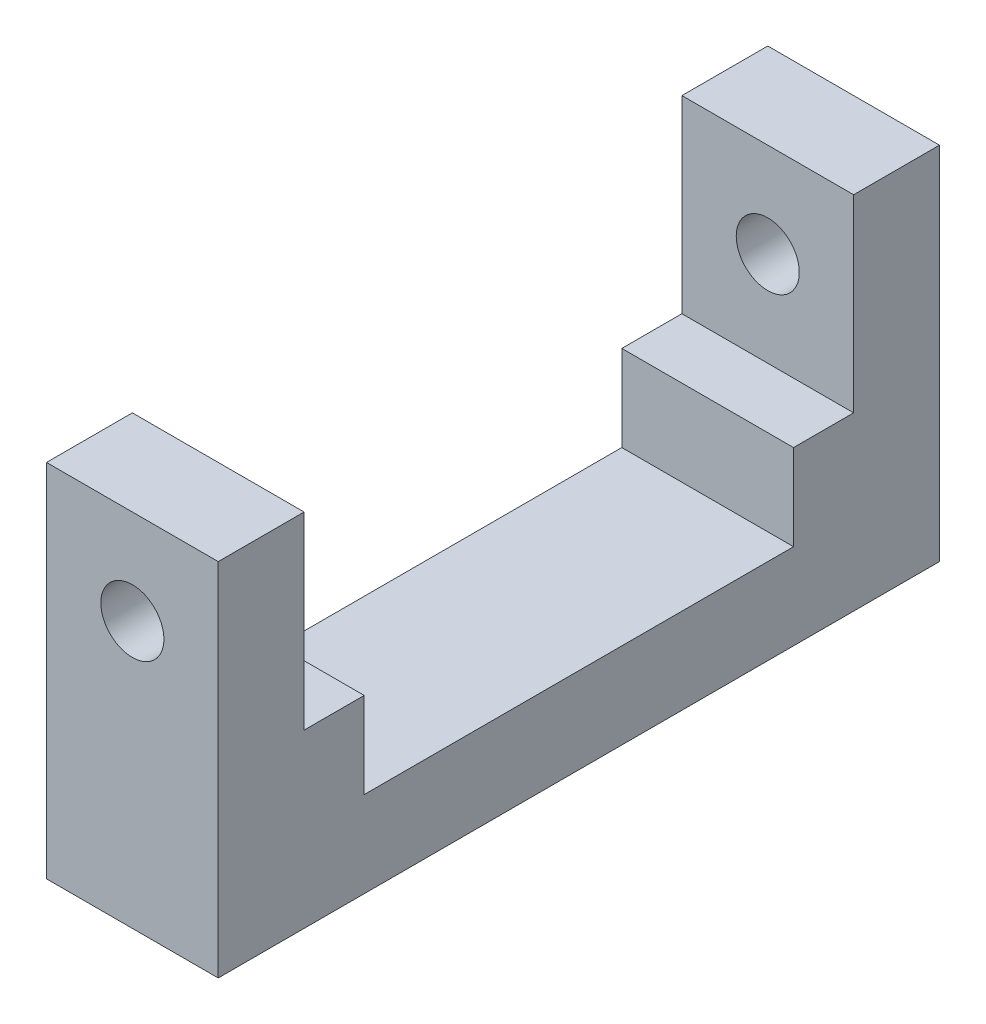
ISO-10303-21;
HEADER;
FILE_DESCRIPTION(('STEP AP214'),'2;1');
FILE_NAME('part.step','',(''),(''),'','','');
FILE_SCHEMA(('AUTOMOTIVE_DESIGN { 1 0 10303 214 1 1 1 1 }'));
ENDSEC;
DATA;
#1=APPLICATION_CONTEXT('core data for automotive mechanical design processes');
#2=APPLICATION_PROTOCOL_DEFINITION('international standard','automotive_design',2000,#1);
#3=PRODUCT_CONTEXT('',#1,'mechanical');
#4=PRODUCT('Part','Part','',(#3));
#5=PRODUCT_RELATED_PRODUCT_CATEGORY('part','',(#4));
#6=PRODUCT_DEFINITION_FORMATION('','',#4);
#7=PRODUCT_DEFINITION_CONTEXT('part definition',#1,'design');
#8=PRODUCT_DEFINITION('design','',#6,#7);
#9=PRODUCT_DEFINITION_SHAPE('','',#8);
#10=(LENGTH_UNIT() NAMED_UNIT(*) SI_UNIT(.MILLI.,.METRE.));
#11=(NAMED_UNIT(*) PLANE_ANGLE_UNIT() SI_UNIT($,.RADIAN.));
#12=(NAMED_UNIT(*) SI_UNIT($,.STERADIAN.) SOLID_ANGLE_UNIT());
#13=UNCERTAINTY_MEASURE_WITH_UNIT(LENGTH_MEASURE(1.E-05),#10,'distance_accuracy_value','');
#14=(GEOMETRIC_REPRESENTATION_CONTEXT(3) GLOBAL_UNCERTAINTY_ASSIGNED_CONTEXT((#13)) GLOBAL_UNIT_ASSIGNED_CONTEXT((#10,
#11,#12)) REPRESENTATION_CONTEXT('',''));
#15=CARTESIAN_POINT('',(0.,0.,0.));
#16=DIRECTION('',(0.,0.,1.));
#17=DIRECTION('',(1.,0.,0.));
#18=AXIS2_PLACEMENT_3D('',#15,#16,#17);
#19=CARTESIAN_POINT('',(10.,0.,-16.));
#20=DIRECTION('',(0.,0.,-1.));
#21=DIRECTION('',(-1.,0.,0.));
#22=AXIS2_PLACEMENT_3D('',#19,#20,#21);
#23=PLANE('',#22);
#24=CARTESIAN_POINT('',(5.,5.,-16.));
#25=DIRECTION('',(0.,0.,-1.));
#26=DIRECTION('',(-1.,0.,0.));
#27=AXIS2_PLACEMENT_3D('',#24,#25,#26);
#28=CIRCLE('',#27,1.83658591452709);
#29=CARTESIAN_POINT('',(3.16341408547291,5.,-16.));
#30=VERTEX_POINT('',#29);
#31=EDGE_CURVE('E168',#30,#30,#28,.F.);
#32=ORIENTED_EDGE('',*,*,#31,.F.);
#33=EDGE_LOOP('',(#32));
#34=FACE_BOUND('',#33,.T.);
#35=DIRECTION('',(-1.,0.,0.));
#36=VECTOR('',#35,1.);
#37=CARTESIAN_POINT('',(10.,-0.500000000000001,-16.));
#38=LINE('',#37,#36);
#39=CARTESIAN_POINT('',(10.,-0.500000000000001,-16.));
#40=VERTEX_POINT('',#39);
#41=CARTESIAN_POINT('',(0.,-0.500000000000001,-16.));
#42=VERTEX_POINT('',#41);
#43=EDGE_CURVE('E12',#40,#42,#38,.T.);
#44=ORIENTED_EDGE('',*,*,#43,.F.);
#45=DIRECTION('',(0.,-1.,0.));
#46=VECTOR('',#45,1.);
#47=CARTESIAN_POINT('',(10.,0.,-16.));
#48=LINE('',#47,#46);
#49=CARTESIAN_POINT('',(10.,10.5,-16.));
#50=VERTEX_POINT('',#49);
#51=EDGE_CURVE('E278',#50,#40,#48,.T.);
#52=ORIENTED_EDGE('',*,*,#51,.F.);
#53=DIRECTION('',(-1.,0.,0.));
#54=VECTOR('',#53,1.);
#55=CARTESIAN_POINT('',(10.,10.5,-16.));
#56=LINE('',#55,#54);
#57=CARTESIAN_POINT('',(0.,10.5,-16.));
#58=VERTEX_POINT('',#57);
#59=EDGE_CURVE('E184',#50,#58,#56,.T.);
#60=ORIENTED_EDGE('',*,*,#59,.T.);
#61=DIRECTION('',(0.,-1.,0.));
#62=VECTOR('',#61,1.);
#63=CARTESIAN_POINT('',(0.,0.,-16.));
#64=LINE('',#63,#62);
#65=EDGE_CURVE('E203',#58,#42,#64,.T.);
#66=ORIENTED_EDGE('',*,*,#65,.T.);
#67=EDGE_LOOP('',(#44,#52,#60,#66));
#68=FACE_BOUND('',#67,.T.);
#69=ADVANCED_FACE('F107',(#34,#68),#23,.F.);
#70=CARTESIAN_POINT('',(10.,-5.5,0.));
#71=DIRECTION('',(0.,1.,0.));
#72=DIRECTION('',(0.,0.,1.));
#73=AXIS2_PLACEMENT_3D('',#70,#71,#72);
#74=PLANE('',#73);
#75=DIRECTION('',(0.,0.,-1.));
#76=VECTOR('',#75,1.);
#77=CARTESIAN_POINT('',(0.,-5.5,0.));
#78=LINE('',#77,#76);
#79=CARTESIAN_POINT('',(0.,-5.5,12.5));
#80=VERTEX_POINT('',#79);
#81=CARTESIAN_POINT('',(0.,-5.5,-12.5));
#82=VERTEX_POINT('',#81);
#83=EDGE_CURVE('E173',#80,#82,#78,.T.);
#84=ORIENTED_EDGE('',*,*,#83,.F.);
#85=DIRECTION('',(1.,0.,0.));
#86=VECTOR('',#85,1.);
#87=CARTESIAN_POINT('',(10.,-5.5,12.5));
#88=LINE('',#87,#86);
#89=CARTESIAN_POINT('',(10.,-5.5,12.5));
#90=VERTEX_POINT('',#89);
#91=EDGE_CURVE('E117',#80,#90,#88,.T.);
#92=ORIENTED_EDGE('',*,*,#91,.T.);
#93=DIRECTION('',(0.,0.,-1.));
#94=VECTOR('',#93,1.);
#95=CARTESIAN_POINT('',(10.,-5.5,0.));
#96=LINE('',#95,#94);
#97=CARTESIAN_POINT('',(10.,-5.5,-12.5));
#98=VERTEX_POINT('',#97);
#99=EDGE_CURVE('E276',#90,#98,#96,.T.);
#100=ORIENTED_EDGE('',*,*,#99,.T.);
#101=DIRECTION('',(-1.,0.,0.));
#102=VECTOR('',#101,1.);
#103=CARTESIAN_POINT('',(10.,-5.5,-12.5));
#104=LINE('',#103,#102);
#105=EDGE_CURVE('E178',#98,#82,#104,.T.);
#106=ORIENTED_EDGE('',*,*,#105,.T.);
#107=EDGE_LOOP('',(#84,#92,#100,#106));
#108=FACE_BOUND('',#107,.T.);
#109=ADVANCED_FACE('F218',(#108),#74,.T.);
#110=CARTESIAN_POINT('',(10.,0.,16.));
#111=DIRECTION('',(0.,0.,-1.));
#112=DIRECTION('',(0.,1.,0.));
#113=AXIS2_PLACEMENT_3D('',#110,#111,#112);
#114=PLANE('',#113);
#115=CARTESIAN_POINT('',(5.,5.,16.));
#116=DIRECTION('',(0.,0.,-1.));
#117=DIRECTION('',(0.,1.,0.));
#118=AXIS2_PLACEMENT_3D('',#115,#116,#117);
#119=CIRCLE('',#118,1.83658591452709);
#120=CARTESIAN_POINT('',(3.16341408547291,5.,16.));
#121=VERTEX_POINT('',#120);
#122=EDGE_CURVE('E284',#121,#121,#119,.F.);
#123=ORIENTED_EDGE('',*,*,#122,.T.);
#124=EDGE_LOOP('',(#123));
#125=FACE_BOUND('',#124,.T.);
#126=DIRECTION('',(0.,-1.,0.));
#127=VECTOR('',#126,1.);
#128=CARTESIAN_POINT('',(10.,0.,16.));
#129=LINE('',#128,#127);
#130=CARTESIAN_POINT('',(10.,10.5,16.));
#131=VERTEX_POINT('',#130);
#132=CARTESIAN_POINT('',(10.,-0.500000000000004,16.));
#133=VERTEX_POINT('',#132);
#134=EDGE_CURVE('E274',#131,#133,#129,.T.);
#135=ORIENTED_EDGE('',*,*,#134,.T.);
#136=DIRECTION('',(-1.,0.,0.));
#137=VECTOR('',#136,1.);
#138=CARTESIAN_POINT('',(10.,-0.500000000000004,16.));
#139=LINE('',#138,#137);
#140=CARTESIAN_POINT('',(0.,-0.500000000000004,16.));
#141=VERTEX_POINT('',#140);
#142=EDGE_CURVE('E126',#133,#141,#139,.T.);
#143=ORIENTED_EDGE('',*,*,#142,.T.);
#144=DIRECTION('',(0.,-1.,0.));
#145=VECTOR('',#144,1.);
#146=CARTESIAN_POINT('',(0.,0.,16.));
#147=LINE('',#146,#145);
#148=CARTESIAN_POINT('',(0.,10.5,16.));
#149=VERTEX_POINT('',#148);
#150=EDGE_CURVE('E219',#149,#141,#147,.T.);
#151=ORIENTED_EDGE('',*,*,#150,.F.);
#152=DIRECTION('',(-1.,0.,0.));
#153=VECTOR('',#152,1.);
#154=CARTESIAN_POINT('',(10.,10.5,16.));
#155=LINE('',#154,#153);
#156=EDGE_CURVE('E191',#131,#149,#155,.T.);
#157=ORIENTED_EDGE('',*,*,#156,.F.);
#158=EDGE_LOOP('',(#135,#143,#151,#157));
#159=FACE_BOUND('',#158,.T.);
#160=ADVANCED_FACE('F262',(#125,#159),#114,.T.);
#161=CARTESIAN_POINT('',(10.,10.5,0.));
#162=DIRECTION('',(0.,1.,0.));
#163=DIRECTION('',(0.,0.,1.));
#164=AXIS2_PLACEMENT_3D('',#161,#162,#163);
#165=PLANE('',#164);
#166=DIRECTION('',(0.,0.,-1.));
#167=VECTOR('',#166,1.);
#168=CARTESIAN_POINT('',(0.,10.5,0.));
#169=LINE('',#168,#167);
#170=CARTESIAN_POINT('',(0.,10.5,21.));
#171=VERTEX_POINT('',#170);
#172=EDGE_CURVE('E205',#171,#149,#169,.T.);
#173=ORIENTED_EDGE('',*,*,#172,.F.);
#174=DIRECTION('',(-1.,0.,0.));
#175=VECTOR('',#174,1.);
#176=CARTESIAN_POINT('',(10.,10.5,21.));
#177=LINE('',#176,#175);
#178=CARTESIAN_POINT('',(10.,10.5,21.));
#179=VERTEX_POINT('',#178);
#180=EDGE_CURVE('E244',#179,#171,#177,.T.);
#181=ORIENTED_EDGE('',*,*,#180,.F.);
#182=DIRECTION('',(0.,0.,-1.));
#183=VECTOR('',#182,1.);
#184=CARTESIAN_POINT('',(10.,10.5,0.));
#185=LINE('',#184,#183);
#186=EDGE_CURVE('E259',#179,#131,#185,.T.);
#187=ORIENTED_EDGE('',*,*,#186,.T.);
#188=ORIENTED_EDGE('',*,*,#156,.T.);
#189=EDGE_LOOP('',(#173,#181,#187,#188));
#190=FACE_BOUND('',#189,.T.);
#191=ADVANCED_FACE('F253',(#190),#165,.T.);
#192=CARTESIAN_POINT('',(10.,0.,21.));
#193=DIRECTION('',(0.,0.,1.));
#194=DIRECTION('',(0.,-1.,0.));
#195=AXIS2_PLACEMENT_3D('',#192,#193,#194);
#196=PLANE('',#195);
#197=CARTESIAN_POINT('',(5.,5.,21.));
#198=DIRECTION('',(0.,0.,1.));
#199=DIRECTION('',(0.,-1.,0.));
#200=AXIS2_PLACEMENT_3D('',#197,#198,#199);
#201=CIRCLE('',#200,1.83658591452709);
#202=CARTESIAN_POINT('',(3.16341408547291,5.,21.));
#203=VERTEX_POINT('',#202);
#204=EDGE_CURVE('E287',#203,#203,#201,.F.);
#205=ORIENTED_EDGE('',*,*,#204,.T.);
#206=EDGE_LOOP('',(#205));
#207=FACE_BOUND('',#206,.T.);
#208=DIRECTION('',(0.,1.,0.));
#209=VECTOR('',#208,1.);
#210=CARTESIAN_POINT('',(0.,0.,21.));
#211=LINE('',#210,#209);
#212=CARTESIAN_POINT('',(0.,-10.5,21.));
#213=VERTEX_POINT('',#212);
#214=EDGE_CURVE('E224',#213,#171,#211,.T.);
#215=ORIENTED_EDGE('',*,*,#214,.F.);
#216=DIRECTION('',(-1.,0.,0.));
#217=VECTOR('',#216,1.);
#218=CARTESIAN_POINT('',(10.,-10.5,21.));
#219=LINE('',#218,#217);
#220=CARTESIAN_POINT('',(10.,-10.5,21.));
#221=VERTEX_POINT('',#220);
#222=EDGE_CURVE('E241',#221,#213,#219,.T.);
#223=ORIENTED_EDGE('',*,*,#222,.F.);
#224=DIRECTION('',(0.,1.,0.));
#225=VECTOR('',#224,1.);
#226=CARTESIAN_POINT('',(10.,0.,21.));
#227=LINE('',#226,#225);
#228=EDGE_CURVE('E271',#221,#179,#227,.T.);
#229=ORIENTED_EDGE('',*,*,#228,.T.);
#230=ORIENTED_EDGE('',*,*,#180,.T.);
#231=EDGE_LOOP('',(#215,#223,#229,#230));
#232=FACE_BOUND('',#231,.T.);
#233=ADVANCED_FACE('F342',(#207,#232),#196,.T.);
#234=CARTESIAN_POINT('',(10.,-10.5,0.));
#235=DIRECTION('',(0.,1.,0.));
#236=DIRECTION('',(0.,0.,1.));
#237=AXIS2_PLACEMENT_3D('',#234,#235,#236);
#238=PLANE('',#237);
#239=DIRECTION('',(0.,0.,-1.));
#240=VECTOR('',#239,1.);
#241=CARTESIAN_POINT('',(0.,-10.5,0.));
#242=LINE('',#241,#240);
#243=CARTESIAN_POINT('',(0.,-10.5,-21.));
#244=VERTEX_POINT('',#243);
#245=EDGE_CURVE('E227',#213,#244,#242,.T.);
#246=ORIENTED_EDGE('',*,*,#245,.T.);
#247=DIRECTION('',(-1.,0.,0.));
#248=VECTOR('',#247,1.);
#249=CARTESIAN_POINT('',(10.,-10.5,-21.));
#250=LINE('',#249,#248);
#251=CARTESIAN_POINT('',(10.,-10.5,-21.));
#252=VERTEX_POINT('',#251);
#253=EDGE_CURVE('E237',#252,#244,#250,.T.);
#254=ORIENTED_EDGE('',*,*,#253,.F.);
#255=DIRECTION('',(0.,0.,-1.));
#256=VECTOR('',#255,1.);
#257=CARTESIAN_POINT('',(10.,-10.5,0.));
#258=LINE('',#257,#256);
#259=EDGE_CURVE('E268',#221,#252,#258,.T.);
#260=ORIENTED_EDGE('',*,*,#259,.F.);
#261=ORIENTED_EDGE('',*,*,#222,.T.);
#262=EDGE_LOOP('',(#246,#254,#260,#261));
#263=FACE_BOUND('',#262,.T.);
#264=ADVANCED_FACE('F301',(#263),#238,.F.);
#265=CARTESIAN_POINT('',(10.,0.,-21.));
#266=DIRECTION('',(0.,0.,1.));
#267=DIRECTION('',(0.,-1.,0.));
#268=AXIS2_PLACEMENT_3D('',#265,#266,#267);
#269=PLANE('',#268);
#270=CARTESIAN_POINT('',(5.,5.,-21.));
#271=DIRECTION('',(0.,0.,1.));
#272=DIRECTION('',(0.,-1.,0.));
#273=AXIS2_PLACEMENT_3D('',#270,#271,#272);
#274=CIRCLE('',#273,1.83658591452709);
#275=CARTESIAN_POINT('',(3.16341408547291,5.,-21.));
#276=VERTEX_POINT('',#275);
#277=EDGE_CURVE('E111',#276,#276,#274,.F.);
#278=ORIENTED_EDGE('',*,*,#277,.F.);
#279=EDGE_LOOP('',(#278));
#280=FACE_BOUND('',#279,.T.);
#281=DIRECTION('',(0.,1.,0.));
#282=VECTOR('',#281,1.);
#283=CARTESIAN_POINT('',(0.,0.,-21.));
#284=LINE('',#283,#282);
#285=CARTESIAN_POINT('',(0.,10.5,-21.));
#286=VERTEX_POINT('',#285);
#287=EDGE_CURVE('E230',#244,#286,#284,.T.);
#288=ORIENTED_EDGE('',*,*,#287,.T.);
#289=DIRECTION('',(-1.,0.,0.));
#290=VECTOR('',#289,1.);
#291=CARTESIAN_POINT('',(10.,10.5,-21.));
#292=LINE('',#291,#290);
#293=CARTESIAN_POINT('',(10.,10.5,-21.));
#294=VERTEX_POINT('',#293);
#295=EDGE_CURVE('E234',#294,#286,#292,.T.);
#296=ORIENTED_EDGE('',*,*,#295,.F.);
#297=DIRECTION('',(0.,1.,0.));
#298=VECTOR('',#297,1.);
#299=CARTESIAN_POINT('',(10.,0.,-21.));
#300=LINE('',#299,#298);
#301=EDGE_CURVE('E238',#252,#294,#300,.T.);
#302=ORIENTED_EDGE('',*,*,#301,.F.);
#303=ORIENTED_EDGE('',*,*,#253,.T.);
#304=EDGE_LOOP('',(#288,#296,#302,#303));
#305=FACE_BOUND('',#304,.T.);
#306=ADVANCED_FACE('F297',(#280,#305),#269,.F.);
#307=EDGE_CURVE('E198',#58,#286,#169,.T.);
#308=ORIENTED_EDGE('',*,*,#307,.F.);
#309=ORIENTED_EDGE('',*,*,#59,.F.);
#310=EDGE_CURVE('E233',#50,#294,#185,.T.);
#311=ORIENTED_EDGE('',*,*,#310,.T.);
#312=ORIENTED_EDGE('',*,*,#295,.T.);
#313=EDGE_LOOP('',(#308,#309,#311,#312));
#314=FACE_BOUND('',#313,.T.);
#315=ADVANCED_FACE('F300',(#314),#165,.T.);
#316=CARTESIAN_POINT('',(0.,0.,0.));
#317=DIRECTION('',(1.,0.,0.));
#318=DIRECTION('',(0.,0.,-1.));
#319=AXIS2_PLACEMENT_3D('',#316,#317,#318);
#320=PLANE('',#319);
#321=DIRECTION('',(0.,1.,0.));
#322=VECTOR('',#321,1.);
#323=CARTESIAN_POINT('',(0.,-5.5,12.5));
#324=LINE('',#323,#322);
#325=CARTESIAN_POINT('',(0.,-0.5,12.5));
#326=VERTEX_POINT('',#325);
#327=EDGE_CURVE('E195',#80,#326,#324,.T.);
#328=ORIENTED_EDGE('',*,*,#327,.F.);
#329=ORIENTED_EDGE('',*,*,#83,.T.);
#330=DIRECTION('',(0.,1.,0.));
#331=VECTOR('',#330,1.);
#332=CARTESIAN_POINT('',(0.,-5.5,-12.5));
#333=LINE('',#332,#331);
#334=CARTESIAN_POINT('',(0.,-0.500000000000001,-12.5));
#335=VERTEX_POINT('',#334);
#336=EDGE_CURVE('E156',#82,#335,#333,.T.);
#337=ORIENTED_EDGE('',*,*,#336,.T.);
#338=DIRECTION('',(0.,0.,1.));
#339=VECTOR('',#338,1.);
#340=CARTESIAN_POINT('',(0.,-0.500000000000001,-16.));
#341=LINE('',#340,#339);
#342=EDGE_CURVE('E162',#42,#335,#341,.T.);
#343=ORIENTED_EDGE('',*,*,#342,.F.);
#344=ORIENTED_EDGE('',*,*,#65,.F.);
#345=ORIENTED_EDGE('',*,*,#307,.T.);
#346=ORIENTED_EDGE('',*,*,#287,.F.);
#347=ORIENTED_EDGE('',*,*,#245,.F.);
#348=ORIENTED_EDGE('',*,*,#214,.T.);
#349=ORIENTED_EDGE('',*,*,#172,.T.);
#350=ORIENTED_EDGE('',*,*,#150,.T.);
#351=DIRECTION('',(0.,0.,-1.));
#352=VECTOR('',#351,1.);
#353=CARTESIAN_POINT('',(0.,-0.500000000000004,16.));
#354=LINE('',#353,#352);
#355=EDGE_CURVE('E160',#141,#326,#354,.T.);
#356=ORIENTED_EDGE('',*,*,#355,.T.);
#357=EDGE_LOOP('',(#328,#329,#337,#343,#344,#345,#346,#347,#348,#349,#350,#356));
#358=FACE_BOUND('',#357,.T.);
#359=ADVANCED_FACE('F171',(#358),#320,.F.);
#360=CARTESIAN_POINT('',(10.,0.,0.));
#361=DIRECTION('',(1.,0.,0.));
#362=DIRECTION('',(0.,0.,-1.));
#363=AXIS2_PLACEMENT_3D('',#360,#361,#362);
#364=PLANE('',#363);
#365=ORIENTED_EDGE('',*,*,#99,.F.);
#366=DIRECTION('',(0.,1.,0.));
#367=VECTOR('',#366,1.);
#368=CARTESIAN_POINT('',(10.,-5.5,12.5));
#369=LINE('',#368,#367);
#370=CARTESIAN_POINT('',(10.,-0.5,12.5));
#371=VERTEX_POINT('',#370);
#372=EDGE_CURVE('E199',#90,#371,#369,.T.);
#373=ORIENTED_EDGE('',*,*,#372,.T.);
#374=DIRECTION('',(0.,0.,-1.));
#375=VECTOR('',#374,1.);
#376=CARTESIAN_POINT('',(10.,-0.500000000000004,16.));
#377=LINE('',#376,#375);
#378=EDGE_CURVE('E206',#133,#371,#377,.T.);
#379=ORIENTED_EDGE('',*,*,#378,.F.);
#380=ORIENTED_EDGE('',*,*,#134,.F.);
#381=ORIENTED_EDGE('',*,*,#186,.F.);
#382=ORIENTED_EDGE('',*,*,#228,.F.);
#383=ORIENTED_EDGE('',*,*,#259,.T.);
#384=ORIENTED_EDGE('',*,*,#301,.T.);
#385=ORIENTED_EDGE('',*,*,#310,.F.);
#386=ORIENTED_EDGE('',*,*,#51,.T.);
#387=DIRECTION('',(0.,0.,1.));
#388=VECTOR('',#387,1.);
#389=CARTESIAN_POINT('',(10.,-0.500000000000001,-16.));
#390=LINE('',#389,#388);
#391=CARTESIAN_POINT('',(10.,-0.500000000000001,-12.5));
#392=VERTEX_POINT('',#391);
#393=EDGE_CURVE('E145',#40,#392,#390,.T.);
#394=ORIENTED_EDGE('',*,*,#393,.T.);
#395=DIRECTION('',(0.,1.,0.));
#396=VECTOR('',#395,1.);
#397=CARTESIAN_POINT('',(10.,-5.5,-12.5));
#398=LINE('',#397,#396);
#399=EDGE_CURVE('E158',#98,#392,#398,.T.);
#400=ORIENTED_EDGE('',*,*,#399,.F.);
#401=EDGE_LOOP('',(#365,#373,#379,#380,#381,#382,#383,#384,#385,#386,#394,#400));
#402=FACE_BOUND('',#401,.T.);
#403=ADVANCED_FACE('F330',(#402),#364,.T.);
#404=CARTESIAN_POINT('',(10.,-5.5,-12.5));
#405=DIRECTION('',(0.,0.,1.));
#406=DIRECTION('',(1.,0.,0.));
#407=AXIS2_PLACEMENT_3D('',#404,#405,#406);
#408=PLANE('',#407);
#409=ORIENTED_EDGE('',*,*,#336,.F.);
#410=ORIENTED_EDGE('',*,*,#105,.F.);
#411=ORIENTED_EDGE('',*,*,#399,.T.);
#412=DIRECTION('',(-1.,0.,0.));
#413=VECTOR('',#412,1.);
#414=CARTESIAN_POINT('',(10.,-0.500000000000001,-12.5));
#415=LINE('',#414,#413);
#416=EDGE_CURVE('E151',#392,#335,#415,.T.);
#417=ORIENTED_EDGE('',*,*,#416,.T.);
#418=EDGE_LOOP('',(#409,#410,#411,#417));
#419=FACE_BOUND('',#418,.T.);
#420=ADVANCED_FACE('F153',(#419),#408,.T.);
#421=CARTESIAN_POINT('',(10.,-0.500000000000001,-16.));
#422=DIRECTION('',(0.,-1.,0.));
#423=DIRECTION('',(0.,0.,-1.));
#424=AXIS2_PLACEMENT_3D('',#421,#422,#423);
#425=PLANE('',#424);
#426=ORIENTED_EDGE('',*,*,#342,.T.);
#427=ORIENTED_EDGE('',*,*,#416,.F.);
#428=ORIENTED_EDGE('',*,*,#393,.F.);
#429=ORIENTED_EDGE('',*,*,#43,.T.);
#430=EDGE_LOOP('',(#426,#427,#428,#429));
#431=FACE_BOUND('',#430,.T.);
#432=ADVANCED_FACE('F109',(#431),#425,.F.);
#433=CARTESIAN_POINT('',(10.,-5.5,12.5));
#434=DIRECTION('',(0.,0.,1.));
#435=DIRECTION('',(1.,0.,0.));
#436=AXIS2_PLACEMENT_3D('',#433,#434,#435);
#437=PLANE('',#436);
#438=ORIENTED_EDGE('',*,*,#327,.T.);
#439=DIRECTION('',(-1.,0.,0.));
#440=VECTOR('',#439,1.);
#441=CARTESIAN_POINT('',(10.,-0.5,12.5));
#442=LINE('',#441,#440);
#443=EDGE_CURVE('E197',#371,#326,#442,.T.);
#444=ORIENTED_EDGE('',*,*,#443,.F.);
#445=ORIENTED_EDGE('',*,*,#372,.F.);
#446=ORIENTED_EDGE('',*,*,#91,.F.);
#447=EDGE_LOOP('',(#438,#444,#445,#446));
#448=FACE_BOUND('',#447,.T.);
#449=ADVANCED_FACE('F215',(#448),#437,.F.);
#450=CARTESIAN_POINT('',(10.,-0.500000000000004,16.));
#451=DIRECTION('',(0.,1.,0.));
#452=DIRECTION('',(0.,0.,1.));
#453=AXIS2_PLACEMENT_3D('',#450,#451,#452);
#454=PLANE('',#453);
#455=ORIENTED_EDGE('',*,*,#355,.F.);
#456=ORIENTED_EDGE('',*,*,#142,.F.);
#457=ORIENTED_EDGE('',*,*,#378,.T.);
#458=ORIENTED_EDGE('',*,*,#443,.T.);
#459=EDGE_LOOP('',(#455,#456,#457,#458));
#460=FACE_BOUND('',#459,.T.);
#461=ADVANCED_FACE('F362',(#460),#454,.T.);
#462=CARTESIAN_POINT('',(5.,5.,37.));
#463=DIRECTION('',(0.,0.,-1.));
#464=DIRECTION('',(-1.,0.,0.));
#465=AXIS2_PLACEMENT_3D('',#462,#463,#464);
#466=CYLINDRICAL_SURFACE('',#465,1.83658591452709);
#467=CARTESIAN_POINT('',(3.16341408547291,5.,-21.));
#468=CARTESIAN_POINT('',(3.16341408547291,5.,-20.9479166666667));
#469=CARTESIAN_POINT('',(3.16341408547291,5.,-20.8958333333333));
#470=CARTESIAN_POINT('',(3.16341408547291,5.,-20.7916666666667));
#471=CARTESIAN_POINT('',(3.16341408547291,5.,-20.7395833333333));
#472=CARTESIAN_POINT('',(3.16341408547291,5.,-20.6354166666667));
#473=CARTESIAN_POINT('',(3.16341408547291,5.,-20.5833333333333));
#474=CARTESIAN_POINT('',(3.16341408547291,5.,-20.4791666666667));
#475=CARTESIAN_POINT('',(3.16341408547291,5.,-20.4270833333333));
#476=CARTESIAN_POINT('',(3.16341408547291,5.,-20.3229166666667));
#477=CARTESIAN_POINT('',(3.16341408547291,5.,-20.2708333333333));
#478=CARTESIAN_POINT('',(3.16341408547291,5.,-20.1666666666667));
#479=CARTESIAN_POINT('',(3.16341408547291,5.,-20.1145833333333));
#480=CARTESIAN_POINT('',(3.16341408547291,5.,-20.0104166666667));
#481=CARTESIAN_POINT('',(3.16341408547291,5.,-19.9583333333333));
#482=CARTESIAN_POINT('',(3.16341408547291,5.,-19.8541666666667));
#483=CARTESIAN_POINT('',(3.16341408547291,5.,-19.8020833333333));
#484=CARTESIAN_POINT('',(3.16341408547291,5.,-19.6979166666667));
#485=CARTESIAN_POINT('',(3.16341408547291,5.,-19.6458333333333));
#486=CARTESIAN_POINT('',(3.16341408547291,5.,-19.5416666666667));
#487=CARTESIAN_POINT('',(3.16341408547291,5.,-19.4895833333333));
#488=CARTESIAN_POINT('',(3.16341408547291,5.,-19.3854166666667));
#489=CARTESIAN_POINT('',(3.16341408547291,5.,-19.3333333333333));
#490=CARTESIAN_POINT('',(3.16341408547291,5.,-19.2291666666667));
#491=CARTESIAN_POINT('',(3.16341408547291,5.,-19.1770833333333));
#492=CARTESIAN_POINT('',(3.16341408547291,5.,-19.0729166666667));
#493=CARTESIAN_POINT('',(3.16341408547291,5.,-19.0208333333333));
#494=CARTESIAN_POINT('',(3.16341408547291,5.,-18.9166666666667));
#495=CARTESIAN_POINT('',(3.16341408547291,5.,-18.8645833333333));
#496=CARTESIAN_POINT('',(3.16341408547291,5.,-18.7604166666667));
#497=CARTESIAN_POINT('',(3.16341408547291,5.,-18.7083333333333));
#498=CARTESIAN_POINT('',(3.16341408547291,5.,-18.6041666666667));
#499=CARTESIAN_POINT('',(3.16341408547291,5.,-18.5520833333333));
#500=CARTESIAN_POINT('',(3.16341408547291,5.,-18.4479166666667));
#501=CARTESIAN_POINT('',(3.16341408547291,5.,-18.3958333333333));
#502=CARTESIAN_POINT('',(3.16341408547291,5.,-18.2916666666667));
#503=CARTESIAN_POINT('',(3.16341408547291,5.,-18.2395833333333));
#504=CARTESIAN_POINT('',(3.16341408547291,5.,-18.1354166666667));
#505=CARTESIAN_POINT('',(3.16341408547291,5.,-18.0833333333333));
#506=CARTESIAN_POINT('',(3.16341408547291,5.,-17.9791666666667));
#507=CARTESIAN_POINT('',(3.16341408547291,5.,-17.9270833333333));
#508=CARTESIAN_POINT('',(3.16341408547291,5.,-17.8229166666667));
#509=CARTESIAN_POINT('',(3.16341408547291,5.,-17.7708333333333));
#510=CARTESIAN_POINT('',(3.16341408547291,5.,-17.6666666666667));
#511=CARTESIAN_POINT('',(3.16341408547291,5.,-17.6145833333333));
#512=CARTESIAN_POINT('',(3.16341408547291,5.,-17.5104166666667));
#513=CARTESIAN_POINT('',(3.16341408547291,5.,-17.4583333333333));
#514=CARTESIAN_POINT('',(3.16341408547291,5.,-17.3541666666667));
#515=CARTESIAN_POINT('',(3.16341408547291,5.,-17.3020833333333));
#516=CARTESIAN_POINT('',(3.16341408547291,5.,-17.1979166666667));
#517=CARTESIAN_POINT('',(3.16341408547291,5.,-17.1458333333333));
#518=CARTESIAN_POINT('',(3.16341408547291,5.,-17.0416666666667));
#519=CARTESIAN_POINT('',(3.16341408547291,5.,-16.9895833333333));
#520=CARTESIAN_POINT('',(3.16341408547291,5.,-16.8854166666667));
#521=CARTESIAN_POINT('',(3.16341408547291,5.,-16.8333333333333));
#522=CARTESIAN_POINT('',(3.16341408547291,5.,-16.7291666666667));
#523=CARTESIAN_POINT('',(3.16341408547291,5.,-16.6770833333333));
#524=CARTESIAN_POINT('',(3.16341408547291,5.,-16.5729166666667));
#525=CARTESIAN_POINT('',(3.16341408547291,5.,-16.5208333333333));
#526=CARTESIAN_POINT('',(3.16341408547291,5.,-16.4166666666667));
#527=CARTESIAN_POINT('',(3.16341408547291,5.,-16.3645833333333));
#528=CARTESIAN_POINT('',(3.16341408547291,5.,-16.2604166666667));
#529=CARTESIAN_POINT('',(3.16341408547291,5.,-16.2083333333333));
#530=CARTESIAN_POINT('',(3.16341408547291,5.,-16.1041666666667));
#531=CARTESIAN_POINT('',(3.16341408547291,5.,-16.0520833333333));
#532=CARTESIAN_POINT('',(3.16341408547291,5.,-16.));
#533=B_SPLINE_CURVE_WITH_KNOTS('',3,(#467,#468,#469,#470,#471,#472,#473,#474,#475,#476,#477,
#478,#479,#480,#481,#482,#483,#484,#485,#486,#487,#488,#489,#490,#491,#492,#493,#494,#495,#496,
#497,#498,#499,#500,#501,#502,#503,#504,#505,#506,#507,#508,#509,#510,#511,#512,#513,#514,#515,
#516,#517,#518,#519,#520,#521,#522,#523,#524,#525,#526,#527,#528,#529,#530,#531,#532),
.UNSPECIFIED.,.F.,.F.,(4,2,2,2,2,2,2,2,2,2,2,2,2,2,2,2,2,2,2,2,2,2,2,2,2,2,2,2,2,2,2,2,4),(0.,
0.156250000000004,0.3125,0.468750000000004,0.625000000000001,0.781250000000004,
0.937500000000001,1.09375,1.25,1.40625,1.56250000000001,1.71875,1.87500000000001,
2.03125000000001,2.18750000000001,2.34375000000001,2.50000000000001,2.65625000000001,
2.81250000000001,2.96875000000001,3.12500000000001,3.28125000000001,3.43750000000001,
3.59375000000001,3.75000000000002,3.90625000000001,4.06250000000002,4.21875000000001,
4.37500000000002,4.53125000000001,4.68750000000002,4.84375000000002,5.00000000000002),.UNSPECIFIED.);
#534=EDGE_CURVE('BSEAM294',#276,#30,#533,.T.);
#535=ORIENTED_EDGE('',*,*,#277,.T.);
#536=ORIENTED_EDGE('',*,*,#31,.T.);
#537=ORIENTED_EDGE('',*,*,#534,.T.);
#538=ORIENTED_EDGE('',*,*,#534,.F.);
#539=EDGE_LOOP('',(#535,#537,#536,#538));
#540=FACE_BOUND('',#539,.T.);
#541=ADVANCED_FACE('F294',(#540),#466,.F.);
#542=CARTESIAN_POINT('',(3.16341408547291,5.,16.));
#543=CARTESIAN_POINT('',(3.16341408547291,5.,16.0520833333333));
#544=CARTESIAN_POINT('',(3.16341408547291,5.,16.1041666666667));
#545=CARTESIAN_POINT('',(3.16341408547291,5.,16.2083333333333));
#546=CARTESIAN_POINT('',(3.16341408547291,5.,16.2604166666667));
#547=CARTESIAN_POINT('',(3.16341408547291,5.,16.3645833333333));
#548=CARTESIAN_POINT('',(3.16341408547291,5.,16.4166666666667));
#549=CARTESIAN_POINT('',(3.16341408547291,5.,16.5208333333333));
#550=CARTESIAN_POINT('',(3.16341408547291,5.,16.5729166666667));
#551=CARTESIAN_POINT('',(3.16341408547291,5.,16.6770833333333));
#552=CARTESIAN_POINT('',(3.16341408547291,5.,16.7291666666667));
#553=CARTESIAN_POINT('',(3.16341408547291,5.,16.8333333333333));
#554=CARTESIAN_POINT('',(3.16341408547291,5.,16.8854166666667));
#555=CARTESIAN_POINT('',(3.16341408547291,5.,16.9895833333333));
#556=CARTESIAN_POINT('',(3.16341408547291,5.,17.0416666666667));
#557=CARTESIAN_POINT('',(3.16341408547291,5.,17.1458333333333));
#558=CARTESIAN_POINT('',(3.16341408547291,5.,17.1979166666667));
#559=CARTESIAN_POINT('',(3.16341408547291,5.,17.3020833333333));
#560=CARTESIAN_POINT('',(3.16341408547291,5.,17.3541666666667));
#561=CARTESIAN_POINT('',(3.16341408547291,5.,17.4583333333333));
#562=CARTESIAN_POINT('',(3.16341408547291,5.,17.5104166666667));
#563=CARTESIAN_POINT('',(3.16341408547291,5.,17.6145833333333));
#564=CARTESIAN_POINT('',(3.16341408547291,5.,17.6666666666667));
#565=CARTESIAN_POINT('',(3.16341408547291,5.,17.7708333333333));
#566=CARTESIAN_POINT('',(3.16341408547291,5.,17.8229166666667));
#567=CARTESIAN_POINT('',(3.16341408547291,5.,17.9270833333333));
#568=CARTESIAN_POINT('',(3.16341408547291,5.,17.9791666666667));
#569=CARTESIAN_POINT('',(3.16341408547291,5.,18.0833333333333));
#570=CARTESIAN_POINT('',(3.16341408547291,5.,18.1354166666667));
#571=CARTESIAN_POINT('',(3.16341408547291,5.,18.2395833333333));
#572=CARTESIAN_POINT('',(3.16341408547291,5.,18.2916666666667));
#573=CARTESIAN_POINT('',(3.16341408547291,5.,18.3958333333333));
#574=CARTESIAN_POINT('',(3.16341408547291,5.,18.4479166666667));
#575=CARTESIAN_POINT('',(3.16341408547291,5.,18.5520833333333));
#576=CARTESIAN_POINT('',(3.16341408547291,5.,18.6041666666667));
#577=CARTESIAN_POINT('',(3.16341408547291,5.,18.7083333333333));
#578=CARTESIAN_POINT('',(3.16341408547291,5.,18.7604166666667));
#579=CARTESIAN_POINT('',(3.16341408547291,5.,18.8645833333333));
#580=CARTESIAN_POINT('',(3.16341408547291,5.,18.9166666666667));
#581=CARTESIAN_POINT('',(3.16341408547291,5.,19.0208333333333));
#582=CARTESIAN_POINT('',(3.16341408547291,5.,19.0729166666667));
#583=CARTESIAN_POINT('',(3.16341408547291,5.,19.1770833333333));
#584=CARTESIAN_POINT('',(3.16341408547291,5.,19.2291666666667));
#585=CARTESIAN_POINT('',(3.16341408547291,5.,19.3333333333333));
#586=CARTESIAN_POINT('',(3.16341408547291,5.,19.3854166666667));
#587=CARTESIAN_POINT('',(3.16341408547291,5.,19.4895833333333));
#588=CARTESIAN_POINT('',(3.16341408547291,5.,19.5416666666667));
#589=CARTESIAN_POINT('',(3.16341408547291,5.,19.6458333333333));
#590=CARTESIAN_POINT('',(3.16341408547291,5.,19.6979166666667));
#591=CARTESIAN_POINT('',(3.16341408547291,5.,19.8020833333333));
#592=CARTESIAN_POINT('',(3.16341408547291,5.,19.8541666666667));
#593=CARTESIAN_POINT('',(3.16341408547291,5.,19.9583333333333));
#594=CARTESIAN_POINT('',(3.16341408547291,5.,20.0104166666667));
#595=CARTESIAN_POINT('',(3.16341408547291,5.,20.1145833333333));
#596=CARTESIAN_POINT('',(3.16341408547291,5.,20.1666666666667));
#597=CARTESIAN_POINT('',(3.16341408547291,5.,20.2708333333333));
#598=CARTESIAN_POINT('',(3.16341408547291,5.,20.3229166666667));
#599=CARTESIAN_POINT('',(3.16341408547291,5.,20.4270833333333));
#600=CARTESIAN_POINT('',(3.16341408547291,5.,20.4791666666667));
#601=CARTESIAN_POINT('',(3.16341408547291,5.,20.5833333333333));
#602=CARTESIAN_POINT('',(3.16341408547291,5.,20.6354166666667));
#603=CARTESIAN_POINT('',(3.16341408547291,5.,20.7395833333333));
#604=CARTESIAN_POINT('',(3.16341408547291,5.,20.7916666666667));
#605=CARTESIAN_POINT('',(3.16341408547291,5.,20.8958333333333));
#606=CARTESIAN_POINT('',(3.16341408547291,5.,20.9479166666667));
#607=CARTESIAN_POINT('',(3.16341408547291,5.,21.));
#608=B_SPLINE_CURVE_WITH_KNOTS('',3,(#542,#543,#544,#545,#546,#547,#548,#549,#550,#551,#552,
#553,#554,#555,#556,#557,#558,#559,#560,#561,#562,#563,#564,#565,#566,#567,#568,#569,#570,#571,
#572,#573,#574,#575,#576,#577,#578,#579,#580,#581,#582,#583,#584,#585,#586,#587,#588,#589,#590,
#591,#592,#593,#594,#595,#596,#597,#598,#599,#600,#601,#602,#603,#604,#605,#606,#607),
.UNSPECIFIED.,.F.,.F.,(4,2,2,2,2,2,2,2,2,2,2,2,2,2,2,2,2,2,2,2,2,2,2,2,2,2,2,2,2,2,2,2,4),(0.,
0.15625,0.3125,0.46875,0.625000000000001,0.781250000000001,0.937500000000001,1.09375,1.25,
1.40625,1.5625,1.71875,1.875,2.03125,2.1875,2.34375,2.5,2.65625,2.8125,2.96875,3.125,3.28125,
3.4375,3.59375,3.75,3.90625,4.0625,4.21875,4.375,4.53125,4.6875,4.84375,5.),.UNSPECIFIED.);
#609=EDGE_CURVE('BSEAM376',#121,#203,#608,.T.);
#610=ORIENTED_EDGE('',*,*,#122,.F.);
#611=ORIENTED_EDGE('',*,*,#204,.F.);
#612=ORIENTED_EDGE('',*,*,#609,.T.);
#613=ORIENTED_EDGE('',*,*,#609,.F.);
#614=EDGE_LOOP('',(#610,#612,#611,#613));
#615=FACE_BOUND('',#614,.T.);
#616=ADVANCED_FACE('F376',(#615),#466,.F.);
#617=CLOSED_SHELL('',(#69,#109,#160,#191,#233,#264,#306,#315,#359,#403,#420,#432,#449,#461,#541,#616));
#618=MANIFOLD_SOLID_BREP('B2',#617);
#619=ADVANCED_BREP_SHAPE_REPRESENTATION('',(#18,#618),#14);
#620=SHAPE_DEFINITION_REPRESENTATION(#9,#619);
ENDSEC;
END-ISO-10303-21;
